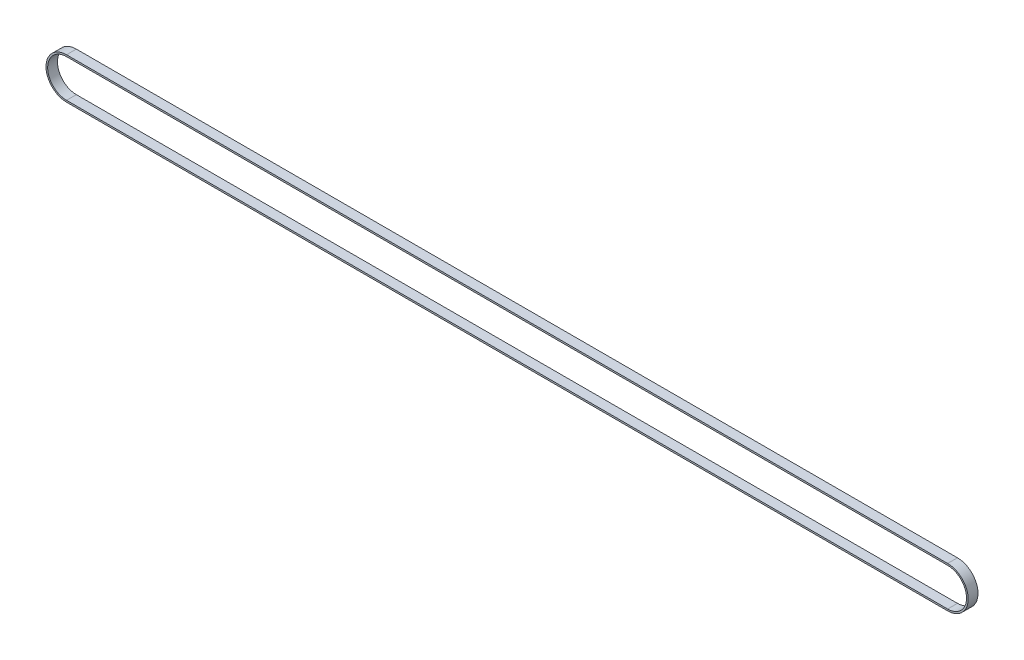
ISO-10303-21;
HEADER;
FILE_DESCRIPTION(('STEP AP214'),'2;1');
FILE_NAME('part.step','',(''),(''),'','','');
FILE_SCHEMA(('AUTOMOTIVE_DESIGN { 1 0 10303 214 1 1 1 1 }'));
ENDSEC;
DATA;
#1=APPLICATION_CONTEXT('core data for automotive mechanical design processes');
#2=APPLICATION_PROTOCOL_DEFINITION('international standard','automotive_design',2000,#1);
#3=PRODUCT_CONTEXT('',#1,'mechanical');
#4=PRODUCT('Part','Part','',(#3));
#5=PRODUCT_RELATED_PRODUCT_CATEGORY('part','',(#4));
#6=PRODUCT_DEFINITION_FORMATION('','',#4);
#7=PRODUCT_DEFINITION_CONTEXT('part definition',#1,'design');
#8=PRODUCT_DEFINITION('design','',#6,#7);
#9=PRODUCT_DEFINITION_SHAPE('','',#8);
#10=(LENGTH_UNIT() NAMED_UNIT(*) SI_UNIT(.MILLI.,.METRE.));
#11=(NAMED_UNIT(*) PLANE_ANGLE_UNIT() SI_UNIT($,.RADIAN.));
#12=(NAMED_UNIT(*) SI_UNIT($,.STERADIAN.) SOLID_ANGLE_UNIT());
#13=UNCERTAINTY_MEASURE_WITH_UNIT(LENGTH_MEASURE(1.E-05),#10,'distance_accuracy_value','');
#14=(GEOMETRIC_REPRESENTATION_CONTEXT(3) GLOBAL_UNCERTAINTY_ASSIGNED_CONTEXT((#13)) GLOBAL_UNIT_ASSIGNED_CONTEXT((#10,
#11,#12)) REPRESENTATION_CONTEXT('',''));
#15=CARTESIAN_POINT('',(0.,0.,0.));
#16=DIRECTION('',(0.,0.,1.));
#17=DIRECTION('',(1.,0.,0.));
#18=AXIS2_PLACEMENT_3D('',#15,#16,#17);
#19=CARTESIAN_POINT('',(-186.5,0.,4.15));
#20=DIRECTION('',(0.,0.,1.));
#21=DIRECTION('',(1.,0.,0.));
#22=AXIS2_PLACEMENT_3D('',#19,#20,#21);
#23=PLANE('',#22);
#24=CARTESIAN_POINT('',(-186.5,0.,4.15));
#25=DIRECTION('',(0.,0.,1.));
#26=DIRECTION('',(1.,0.,0.));
#27=AXIS2_PLACEMENT_3D('',#24,#25,#26);
#28=CIRCLE('',#27,8.7);
#29=CARTESIAN_POINT('',(-186.5,8.7,4.15));
#30=VERTEX_POINT('',#29);
#31=CARTESIAN_POINT('',(-186.5,-8.7,4.15));
#32=VERTEX_POINT('',#31);
#33=EDGE_CURVE('E144',#30,#32,#28,.T.);
#34=ORIENTED_EDGE('',*,*,#33,.T.);
#35=DIRECTION('',(1.,0.,0.));
#36=VECTOR('',#35,1.);
#37=CARTESIAN_POINT('',(-186.5,-8.7,4.15));
#38=LINE('',#37,#36);
#39=CARTESIAN_POINT('',(186.5,-8.7,4.15));
#40=VERTEX_POINT('',#39);
#41=EDGE_CURVE('E147',#32,#40,#38,.T.);
#42=ORIENTED_EDGE('',*,*,#41,.T.);
#43=CARTESIAN_POINT('',(186.5,0.,4.15));
#44=DIRECTION('',(0.,0.,1.));
#45=DIRECTION('',(1.,0.,0.));
#46=AXIS2_PLACEMENT_3D('',#43,#44,#45);
#47=CIRCLE('',#46,8.7);
#48=CARTESIAN_POINT('',(186.5,8.7,4.15));
#49=VERTEX_POINT('',#48);
#50=EDGE_CURVE('E150',#40,#49,#47,.T.);
#51=ORIENTED_EDGE('',*,*,#50,.T.);
#52=DIRECTION('',(-1.,0.,0.));
#53=VECTOR('',#52,1.);
#54=CARTESIAN_POINT('',(-186.5,8.7,4.15));
#55=LINE('',#54,#53);
#56=EDGE_CURVE('E152',#49,#30,#55,.T.);
#57=ORIENTED_EDGE('',*,*,#56,.T.);
#58=EDGE_LOOP('',(#34,#42,#51,#57));
#59=FACE_BOUND('',#58,.T.);
#60=DIRECTION('',(1.,0.,0.));
#61=VECTOR('',#60,1.);
#62=CARTESIAN_POINT('',(-186.5,-8.,4.15));
#63=LINE('',#62,#61);
#64=CARTESIAN_POINT('',(-186.5,-8.,4.15));
#65=VERTEX_POINT('',#64);
#66=CARTESIAN_POINT('',(186.5,-8.,4.15));
#67=VERTEX_POINT('',#66);
#68=EDGE_CURVE('E116',#65,#67,#63,.T.);
#69=ORIENTED_EDGE('',*,*,#68,.F.);
#70=CARTESIAN_POINT('',(-186.5,0.,4.15));
#71=DIRECTION('',(0.,0.,1.));
#72=DIRECTION('',(1.,0.,0.));
#73=AXIS2_PLACEMENT_3D('',#70,#71,#72);
#74=CIRCLE('',#73,8.);
#75=CARTESIAN_POINT('',(-186.5,8.,4.15));
#76=VERTEX_POINT('',#75);
#77=EDGE_CURVE('E108',#76,#65,#74,.T.);
#78=ORIENTED_EDGE('',*,*,#77,.F.);
#79=DIRECTION('',(-1.,0.,0.));
#80=VECTOR('',#79,1.);
#81=CARTESIAN_POINT('',(-186.5,8.,4.15));
#82=LINE('',#81,#80);
#83=CARTESIAN_POINT('',(186.5,8.,4.15));
#84=VERTEX_POINT('',#83);
#85=EDGE_CURVE('E130',#84,#76,#82,.T.);
#86=ORIENTED_EDGE('',*,*,#85,.F.);
#87=CARTESIAN_POINT('',(186.5,0.,4.15));
#88=DIRECTION('',(0.,0.,1.));
#89=DIRECTION('',(1.,0.,0.));
#90=AXIS2_PLACEMENT_3D('',#87,#88,#89);
#91=CIRCLE('',#90,8.);
#92=EDGE_CURVE('E128',#67,#84,#91,.T.);
#93=ORIENTED_EDGE('',*,*,#92,.F.);
#94=EDGE_LOOP('',(#69,#78,#86,#93));
#95=FACE_BOUND('',#94,.T.);
#96=ADVANCED_FACE('F43',(#59,#95),#23,.T.);
#97=CARTESIAN_POINT('',(-186.5,0.,0.));
#98=DIRECTION('',(0.,0.,1.));
#99=DIRECTION('',(1.,0.,0.));
#100=AXIS2_PLACEMENT_3D('',#97,#98,#99);
#101=PLANE('',#100);
#102=CARTESIAN_POINT('',(-186.5,0.,0.));
#103=DIRECTION('',(0.,0.,1.));
#104=DIRECTION('',(1.,0.,0.));
#105=AXIS2_PLACEMENT_3D('',#102,#103,#104);
#106=CIRCLE('',#105,8.7);
#107=CARTESIAN_POINT('',(-186.5,8.7,0.));
#108=VERTEX_POINT('',#107);
#109=CARTESIAN_POINT('',(-186.5,-8.7,0.));
#110=VERTEX_POINT('',#109);
#111=EDGE_CURVE('E124',#108,#110,#106,.T.);
#112=ORIENTED_EDGE('',*,*,#111,.F.);
#113=DIRECTION('',(-1.,0.,0.));
#114=VECTOR('',#113,1.);
#115=CARTESIAN_POINT('',(-186.5,8.7,0.));
#116=LINE('',#115,#114);
#117=CARTESIAN_POINT('',(186.5,8.7,0.));
#118=VERTEX_POINT('',#117);
#119=EDGE_CURVE('E148',#118,#108,#116,.T.);
#120=ORIENTED_EDGE('',*,*,#119,.F.);
#121=CARTESIAN_POINT('',(186.5,0.,0.));
#122=DIRECTION('',(0.,0.,1.));
#123=DIRECTION('',(1.,0.,0.));
#124=AXIS2_PLACEMENT_3D('',#121,#122,#123);
#125=CIRCLE('',#124,8.7);
#126=CARTESIAN_POINT('',(186.5,-8.7,0.));
#127=VERTEX_POINT('',#126);
#128=EDGE_CURVE('E159',#127,#118,#125,.T.);
#129=ORIENTED_EDGE('',*,*,#128,.F.);
#130=DIRECTION('',(1.,0.,0.));
#131=VECTOR('',#130,1.);
#132=CARTESIAN_POINT('',(-186.5,-8.7,0.));
#133=LINE('',#132,#131);
#134=EDGE_CURVE('E157',#110,#127,#133,.T.);
#135=ORIENTED_EDGE('',*,*,#134,.F.);
#136=EDGE_LOOP('',(#112,#120,#129,#135));
#137=FACE_BOUND('',#136,.T.);
#138=CARTESIAN_POINT('',(-186.5,0.,0.));
#139=DIRECTION('',(0.,0.,1.));
#140=DIRECTION('',(1.,0.,0.));
#141=AXIS2_PLACEMENT_3D('',#138,#139,#140);
#142=CIRCLE('',#141,8.);
#143=CARTESIAN_POINT('',(-186.5,8.,0.));
#144=VERTEX_POINT('',#143);
#145=CARTESIAN_POINT('',(-186.5,-8.,0.));
#146=VERTEX_POINT('',#145);
#147=EDGE_CURVE('E66',#144,#146,#142,.T.);
#148=ORIENTED_EDGE('',*,*,#147,.T.);
#149=DIRECTION('',(1.,0.,0.));
#150=VECTOR('',#149,1.);
#151=CARTESIAN_POINT('',(-186.5,-8.,0.));
#152=LINE('',#151,#150);
#153=CARTESIAN_POINT('',(186.5,-8.,0.));
#154=VERTEX_POINT('',#153);
#155=EDGE_CURVE('E123',#146,#154,#152,.T.);
#156=ORIENTED_EDGE('',*,*,#155,.T.);
#157=CARTESIAN_POINT('',(186.5,0.,0.));
#158=DIRECTION('',(0.,0.,1.));
#159=DIRECTION('',(1.,0.,0.));
#160=AXIS2_PLACEMENT_3D('',#157,#158,#159);
#161=CIRCLE('',#160,8.);
#162=CARTESIAN_POINT('',(186.5,8.,0.));
#163=VERTEX_POINT('',#162);
#164=EDGE_CURVE('E136',#154,#163,#161,.T.);
#165=ORIENTED_EDGE('',*,*,#164,.T.);
#166=DIRECTION('',(-1.,0.,0.));
#167=VECTOR('',#166,1.);
#168=CARTESIAN_POINT('',(-186.5,8.,0.));
#169=LINE('',#168,#167);
#170=EDGE_CURVE('E117',#163,#144,#169,.T.);
#171=ORIENTED_EDGE('',*,*,#170,.T.);
#172=EDGE_LOOP('',(#148,#156,#165,#171));
#173=FACE_BOUND('',#172,.T.);
#174=ADVANCED_FACE('F177',(#137,#173),#101,.F.);
#175=CARTESIAN_POINT('',(-186.5,0.,4.15));
#176=DIRECTION('',(0.,0.,-1.));
#177=DIRECTION('',(-1.,0.,0.));
#178=AXIS2_PLACEMENT_3D('',#175,#176,#177);
#179=CYLINDRICAL_SURFACE('',#178,8.7);
#180=ORIENTED_EDGE('',*,*,#111,.T.);
#181=DIRECTION('',(0.,0.,-1.));
#182=VECTOR('',#181,1.);
#183=CARTESIAN_POINT('',(-186.5,-8.7,4.15));
#184=LINE('',#183,#182);
#185=EDGE_CURVE('E11',#32,#110,#184,.T.);
#186=ORIENTED_EDGE('',*,*,#185,.F.);
#187=ORIENTED_EDGE('',*,*,#33,.F.);
#188=DIRECTION('',(0.,0.,-1.));
#189=VECTOR('',#188,1.);
#190=CARTESIAN_POINT('',(-186.5,8.7,4.15));
#191=LINE('',#190,#189);
#192=EDGE_CURVE('E154',#30,#108,#191,.T.);
#193=ORIENTED_EDGE('',*,*,#192,.T.);
#194=EDGE_LOOP('',(#180,#186,#187,#193));
#195=FACE_BOUND('',#194,.T.);
#196=ADVANCED_FACE('F45',(#195),#179,.T.);
#197=CARTESIAN_POINT('',(-186.5,-8.7,4.15));
#198=DIRECTION('',(0.,1.,0.));
#199=DIRECTION('',(0.,0.,1.));
#200=AXIS2_PLACEMENT_3D('',#197,#198,#199);
#201=PLANE('',#200);
#202=ORIENTED_EDGE('',*,*,#134,.T.);
#203=DIRECTION('',(0.,0.,-1.));
#204=VECTOR('',#203,1.);
#205=CARTESIAN_POINT('',(186.5,-8.7,4.15));
#206=LINE('',#205,#204);
#207=EDGE_CURVE('E51',#40,#127,#206,.T.);
#208=ORIENTED_EDGE('',*,*,#207,.F.);
#209=ORIENTED_EDGE('',*,*,#41,.F.);
#210=ORIENTED_EDGE('',*,*,#185,.T.);
#211=EDGE_LOOP('',(#202,#208,#209,#210));
#212=FACE_BOUND('',#211,.T.);
#213=ADVANCED_FACE('F187',(#212),#201,.F.);
#214=CARTESIAN_POINT('',(186.5,0.,4.15));
#215=DIRECTION('',(0.,0.,-1.));
#216=DIRECTION('',(-1.,0.,0.));
#217=AXIS2_PLACEMENT_3D('',#214,#215,#216);
#218=CYLINDRICAL_SURFACE('',#217,8.7);
#219=ORIENTED_EDGE('',*,*,#128,.T.);
#220=DIRECTION('',(0.,0.,-1.));
#221=VECTOR('',#220,1.);
#222=CARTESIAN_POINT('',(186.5,8.7,4.15));
#223=LINE('',#222,#221);
#224=EDGE_CURVE('E164',#49,#118,#223,.T.);
#225=ORIENTED_EDGE('',*,*,#224,.F.);
#226=ORIENTED_EDGE('',*,*,#50,.F.);
#227=ORIENTED_EDGE('',*,*,#207,.T.);
#228=EDGE_LOOP('',(#219,#225,#226,#227));
#229=FACE_BOUND('',#228,.T.);
#230=ADVANCED_FACE('F171',(#229),#218,.T.);
#231=CARTESIAN_POINT('',(-186.5,8.7,4.15));
#232=DIRECTION('',(0.,-1.,0.));
#233=DIRECTION('',(0.,0.,-1.));
#234=AXIS2_PLACEMENT_3D('',#231,#232,#233);
#235=PLANE('',#234);
#236=ORIENTED_EDGE('',*,*,#119,.T.);
#237=ORIENTED_EDGE('',*,*,#192,.F.);
#238=ORIENTED_EDGE('',*,*,#56,.F.);
#239=ORIENTED_EDGE('',*,*,#224,.T.);
#240=EDGE_LOOP('',(#236,#237,#238,#239));
#241=FACE_BOUND('',#240,.T.);
#242=ADVANCED_FACE('F181',(#241),#235,.F.);
#243=CARTESIAN_POINT('',(-186.5,0.,4.15));
#244=DIRECTION('',(0.,0.,-1.));
#245=DIRECTION('',(-1.,0.,0.));
#246=AXIS2_PLACEMENT_3D('',#243,#244,#245);
#247=CYLINDRICAL_SURFACE('',#246,8.);
#248=ORIENTED_EDGE('',*,*,#147,.F.);
#249=DIRECTION('',(0.,0.,-1.));
#250=VECTOR('',#249,1.);
#251=CARTESIAN_POINT('',(-186.5,8.,4.15));
#252=LINE('',#251,#250);
#253=EDGE_CURVE('E112',#76,#144,#252,.T.);
#254=ORIENTED_EDGE('',*,*,#253,.F.);
#255=ORIENTED_EDGE('',*,*,#77,.T.);
#256=DIRECTION('',(0.,0.,-1.));
#257=VECTOR('',#256,1.);
#258=CARTESIAN_POINT('',(-186.5,-8.,4.15));
#259=LINE('',#258,#257);
#260=EDGE_CURVE('E111',#65,#146,#259,.T.);
#261=ORIENTED_EDGE('',*,*,#260,.T.);
#262=EDGE_LOOP('',(#248,#254,#255,#261));
#263=FACE_BOUND('',#262,.T.);
#264=ADVANCED_FACE('F110',(#263),#247,.F.);
#265=CARTESIAN_POINT('',(-186.5,-8.,4.15));
#266=DIRECTION('',(0.,1.,0.));
#267=DIRECTION('',(0.,0.,1.));
#268=AXIS2_PLACEMENT_3D('',#265,#266,#267);
#269=PLANE('',#268);
#270=ORIENTED_EDGE('',*,*,#155,.F.);
#271=ORIENTED_EDGE('',*,*,#260,.F.);
#272=ORIENTED_EDGE('',*,*,#68,.T.);
#273=DIRECTION('',(0.,0.,-1.));
#274=VECTOR('',#273,1.);
#275=CARTESIAN_POINT('',(186.5,-8.,4.15));
#276=LINE('',#275,#274);
#277=EDGE_CURVE('E125',#67,#154,#276,.T.);
#278=ORIENTED_EDGE('',*,*,#277,.T.);
#279=EDGE_LOOP('',(#270,#271,#272,#278));
#280=FACE_BOUND('',#279,.T.);
#281=ADVANCED_FACE('F120',(#280),#269,.T.);
#282=CARTESIAN_POINT('',(186.5,0.,4.15));
#283=DIRECTION('',(0.,0.,-1.));
#284=DIRECTION('',(-1.,0.,0.));
#285=AXIS2_PLACEMENT_3D('',#282,#283,#284);
#286=CYLINDRICAL_SURFACE('',#285,8.);
#287=ORIENTED_EDGE('',*,*,#164,.F.);
#288=ORIENTED_EDGE('',*,*,#277,.F.);
#289=ORIENTED_EDGE('',*,*,#92,.T.);
#290=DIRECTION('',(0.,0.,-1.));
#291=VECTOR('',#290,1.);
#292=CARTESIAN_POINT('',(186.5,8.,4.15));
#293=LINE('',#292,#291);
#294=EDGE_CURVE('E58',#84,#163,#293,.T.);
#295=ORIENTED_EDGE('',*,*,#294,.T.);
#296=EDGE_LOOP('',(#287,#288,#289,#295));
#297=FACE_BOUND('',#296,.T.);
#298=ADVANCED_FACE('F210',(#297),#286,.F.);
#299=CARTESIAN_POINT('',(-186.5,8.,4.15));
#300=DIRECTION('',(0.,-1.,0.));
#301=DIRECTION('',(0.,0.,-1.));
#302=AXIS2_PLACEMENT_3D('',#299,#300,#301);
#303=PLANE('',#302);
#304=ORIENTED_EDGE('',*,*,#170,.F.);
#305=ORIENTED_EDGE('',*,*,#294,.F.);
#306=ORIENTED_EDGE('',*,*,#85,.T.);
#307=ORIENTED_EDGE('',*,*,#253,.T.);
#308=EDGE_LOOP('',(#304,#305,#306,#307));
#309=FACE_BOUND('',#308,.T.);
#310=ADVANCED_FACE('F214',(#309),#303,.T.);
#311=CLOSED_SHELL('',(#96,#174,#196,#213,#230,#242,#264,#281,#298,#310));
#312=MANIFOLD_SOLID_BREP('B2',#311);
#313=ADVANCED_BREP_SHAPE_REPRESENTATION('',(#18,#312),#14);
#314=SHAPE_DEFINITION_REPRESENTATION(#9,#313);
ENDSEC;
END-ISO-10303-21;
